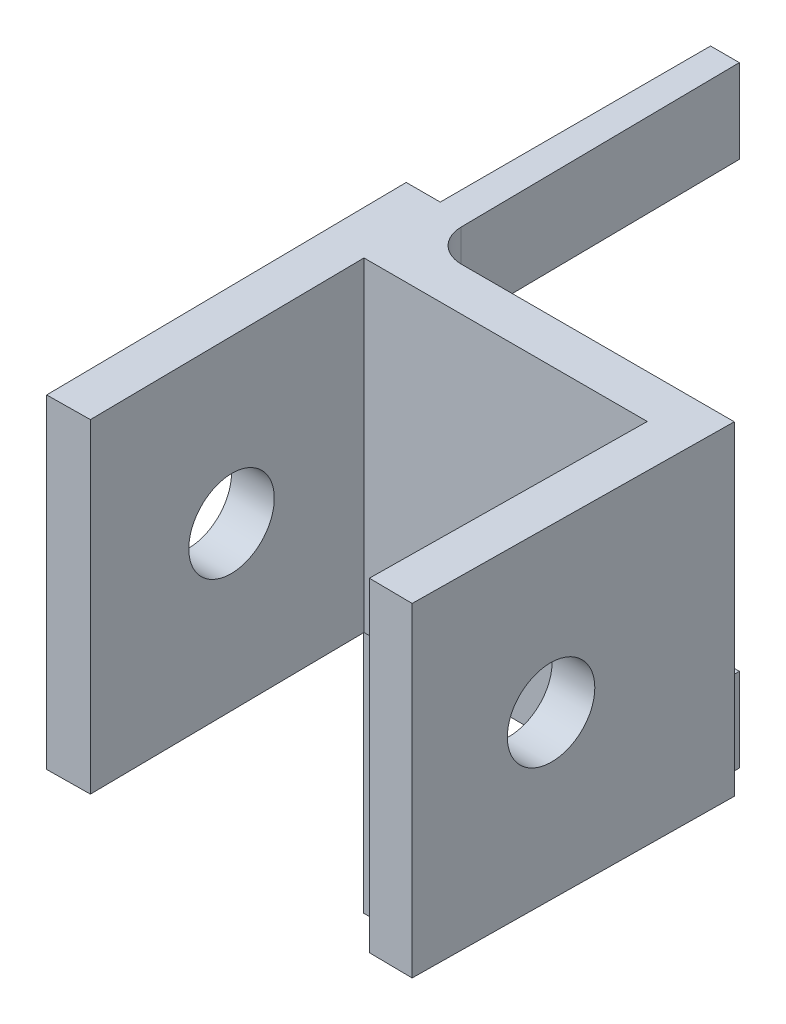
ISO-10303-21;
HEADER;
FILE_DESCRIPTION(('STEP AP214'),'2;1');
FILE_NAME('part.step','',(''),(''),'','','');
FILE_SCHEMA(('AUTOMOTIVE_DESIGN { 1 0 10303 214 1 1 1 1 }'));
ENDSEC;
DATA;
#1=APPLICATION_CONTEXT('core data for automotive mechanical design processes');
#2=APPLICATION_PROTOCOL_DEFINITION('international standard','automotive_design',2000,#1);
#3=PRODUCT_CONTEXT('',#1,'mechanical');
#4=PRODUCT('Part','Part','',(#3));
#5=PRODUCT_RELATED_PRODUCT_CATEGORY('part','',(#4));
#6=PRODUCT_DEFINITION_FORMATION('','',#4);
#7=PRODUCT_DEFINITION_CONTEXT('part definition',#1,'design');
#8=PRODUCT_DEFINITION('design','',#6,#7);
#9=PRODUCT_DEFINITION_SHAPE('','',#8);
#10=(LENGTH_UNIT() NAMED_UNIT(*) SI_UNIT(.MILLI.,.METRE.));
#11=(NAMED_UNIT(*) PLANE_ANGLE_UNIT() SI_UNIT($,.RADIAN.));
#12=(NAMED_UNIT(*) SI_UNIT($,.STERADIAN.) SOLID_ANGLE_UNIT());
#13=UNCERTAINTY_MEASURE_WITH_UNIT(LENGTH_MEASURE(1.E-05),#10,'distance_accuracy_value','');
#14=(GEOMETRIC_REPRESENTATION_CONTEXT(3) GLOBAL_UNCERTAINTY_ASSIGNED_CONTEXT((#13)) GLOBAL_UNIT_ASSIGNED_CONTEXT((#10,
#11,#12)) REPRESENTATION_CONTEXT('',''));
#15=CARTESIAN_POINT('',(0.,0.,0.));
#16=DIRECTION('',(0.,0.,1.));
#17=DIRECTION('',(1.,0.,0.));
#18=AXIS2_PLACEMENT_3D('',#15,#16,#17);
#19=CARTESIAN_POINT('',(-14.0466882817287,-26.5,-20.8));
#20=DIRECTION('',(0.,0.,-1.));
#21=DIRECTION('',(-1.,0.,0.));
#22=AXIS2_PLACEMENT_3D('',#19,#20,#21);
#23=PLANE('',#22);
#24=DIRECTION('',(1.,0.,0.));
#25=VECTOR('',#24,1.);
#26=CARTESIAN_POINT('',(-14.0466882817287,22.25,-20.8));
#27=LINE('',#26,#25);
#28=CARTESIAN_POINT('',(-17.1940246487742,22.25,-20.8));
#29=VERTEX_POINT('',#28);
#30=CARTESIAN_POINT('',(-14.0466882817287,22.25,-20.8));
#31=VERTEX_POINT('',#30);
#32=EDGE_CURVE('E423',#29,#31,#27,.T.);
#33=ORIENTED_EDGE('',*,*,#32,.F.);
#34=DIRECTION('',(0.,1.,0.));
#35=VECTOR('',#34,1.);
#36=CARTESIAN_POINT('',(-17.1940246487742,-26.5,-20.8));
#37=LINE('',#36,#35);
#38=CARTESIAN_POINT('',(-17.1940246487742,30.,-20.8));
#39=VERTEX_POINT('',#38);
#40=EDGE_CURVE('E359',#29,#39,#37,.T.);
#41=ORIENTED_EDGE('',*,*,#40,.T.);
#42=DIRECTION('',(-1.,0.,0.));
#43=VECTOR('',#42,1.);
#44=CARTESIAN_POINT('',(-14.0466882817287,30.,-20.8));
#45=LINE('',#44,#43);
#46=CARTESIAN_POINT('',(-14.0466882817287,30.,-20.8));
#47=VERTEX_POINT('',#46);
#48=EDGE_CURVE('E351',#47,#39,#45,.T.);
#49=ORIENTED_EDGE('',*,*,#48,.F.);
#50=DIRECTION('',(0.,1.,0.));
#51=VECTOR('',#50,1.);
#52=CARTESIAN_POINT('',(-14.0466882817287,-26.5,-20.8));
#53=LINE('',#52,#51);
#54=EDGE_CURVE('E362',#31,#47,#53,.T.);
#55=ORIENTED_EDGE('',*,*,#54,.F.);
#56=EDGE_LOOP('',(#33,#41,#49,#55));
#57=FACE_BOUND('',#56,.T.);
#58=ADVANCED_FACE('F35',(#57),#23,.T.);
#59=CARTESIAN_POINT('',(-14.0466882817289,-26.5,-45.8));
#60=DIRECTION('',(-1.,0.,0.));
#61=DIRECTION('',(0.,0.,1.));
#62=AXIS2_PLACEMENT_3D('',#59,#60,#61);
#63=PLANE('',#62);
#64=DIRECTION('',(0.,0.,-1.));
#65=VECTOR('',#64,1.);
#66=CARTESIAN_POINT('',(-14.0466882817289,22.25,-45.8));
#67=LINE('',#66,#65);
#68=CARTESIAN_POINT('',(-14.0466882817289,22.25,-45.7688164763179));
#69=VERTEX_POINT('',#68);
#70=EDGE_CURVE('E211',#31,#69,#67,.T.);
#71=ORIENTED_EDGE('',*,*,#70,.F.);
#72=ORIENTED_EDGE('',*,*,#54,.T.);
#73=DIRECTION('',(0.,0.,1.));
#74=VECTOR('',#73,1.);
#75=CARTESIAN_POINT('',(-14.0466882817289,30.,-45.8));
#76=LINE('',#75,#74);
#77=CARTESIAN_POINT('',(-14.0466882817289,30.,-45.8));
#78=VERTEX_POINT('',#77);
#79=EDGE_CURVE('E342',#78,#47,#76,.T.);
#80=ORIENTED_EDGE('',*,*,#79,.F.);
#81=DIRECTION('',(0.,1.,0.));
#82=VECTOR('',#81,1.);
#83=CARTESIAN_POINT('',(-14.0466882817289,-26.5,-45.8));
#84=LINE('',#83,#82);
#85=CARTESIAN_POINT('',(-14.0466882817289,22.2445675649289,-45.8));
#86=VERTEX_POINT('',#85);
#87=EDGE_CURVE('E232',#86,#78,#84,.T.);
#88=ORIENTED_EDGE('',*,*,#87,.F.);
#89=DIRECTION('',(0.,0.171623700854752,0.985162578108263));
#90=VECTOR('',#89,1.);
#91=CARTESIAN_POINT('',(-14.046688281729,20.8088112092602,-54.0415973192597));
#92=LINE('',#91,#90);
#93=EDGE_CURVE('E196',#86,#69,#92,.T.);
#94=ORIENTED_EDGE('',*,*,#93,.T.);
#95=EDGE_LOOP('',(#71,#72,#80,#88,#94));
#96=FACE_BOUND('',#95,.T.);
#97=ADVANCED_FACE('F374',(#96),#63,.T.);
#98=CARTESIAN_POINT('',(-11.3856942608503,-26.5,-45.8));
#99=DIRECTION('',(0.,0.,-1.));
#100=DIRECTION('',(-1.,0.,0.));
#101=AXIS2_PLACEMENT_3D('',#98,#99,#100);
#102=PLANE('',#101);
#103=DIRECTION('',(0.,1.,0.));
#104=VECTOR('',#103,1.);
#105=CARTESIAN_POINT('',(-11.3856942608503,-26.5,-45.8));
#106=LINE('',#105,#104);
#107=CARTESIAN_POINT('',(-11.3856942608503,22.25,-45.8000000000001));
#108=VERTEX_POINT('',#107);
#109=CARTESIAN_POINT('',(-11.3856942608503,30.,-45.8));
#110=VERTEX_POINT('',#109);
#111=EDGE_CURVE('E218',#108,#110,#106,.T.);
#112=ORIENTED_EDGE('',*,*,#111,.F.);
#113=DIRECTION('',(-0.999997916133284,-0.00204150167493103,0.));
#114=VECTOR('',#113,1.);
#115=CARTESIAN_POINT('',(-11.4852172601101,22.2497968232069,-45.8));
#116=LINE('',#115,#114);
#117=EDGE_CURVE('E191',#108,#86,#116,.T.);
#118=ORIENTED_EDGE('',*,*,#117,.T.);
#119=ORIENTED_EDGE('',*,*,#87,.T.);
#120=DIRECTION('',(-1.,0.,0.));
#121=VECTOR('',#120,1.);
#122=CARTESIAN_POINT('',(-11.3856942608503,30.,-45.8));
#123=LINE('',#122,#121);
#124=EDGE_CURVE('E227',#110,#78,#123,.T.);
#125=ORIENTED_EDGE('',*,*,#124,.F.);
#126=EDGE_LOOP('',(#112,#118,#119,#125));
#127=FACE_BOUND('',#126,.T.);
#128=ADVANCED_FACE('F225',(#127),#102,.T.);
#129=CARTESIAN_POINT('',(0.,30.,0.));
#130=DIRECTION('',(0.,1.,0.));
#131=DIRECTION('',(0.,0.,1.));
#132=AXIS2_PLACEMENT_3D('',#129,#130,#131);
#133=PLANE('',#132);
#134=DIRECTION('',(-1.,0.,0.));
#135=VECTOR('',#134,1.);
#136=CARTESIAN_POINT('',(-17.1471496487741,30.,-16.8));
#137=LINE('',#136,#135);
#138=CARTESIAN_POINT('',(17.1475230853167,30.,-16.8));
#139=VERTEX_POINT('',#138);
#140=CARTESIAN_POINT('',(-8.08080077426948,30.,-16.8));
#141=VERTEX_POINT('',#140);
#142=EDGE_CURVE('E267',#139,#141,#137,.T.);
#143=ORIENTED_EDGE('',*,*,#142,.T.);
#144=CARTESIAN_POINT('',(-8.08080077426948,30.,-19.8));
#145=DIRECTION('',(0.,1.,0.));
#146=DIRECTION('',(0.,0.,1.));
#147=AXIS2_PLACEMENT_3D('',#144,#145,#146);
#148=CIRCLE('',#147,3.);
#149=CARTESIAN_POINT('',(-11.0805948018314,30.,-19.7648461637395));
#150=VERTEX_POINT('',#149);
#151=EDGE_CURVE('E201',#141,#150,#148,.F.);
#152=ORIENTED_EDGE('',*,*,#151,.T.);
#153=DIRECTION('',(-0.0117179454201706,0.,-0.99993134252064));
#154=VECTOR('',#153,1.);
#155=CARTESIAN_POINT('',(-11.0458505108501,30.,-16.8));
#156=LINE('',#155,#154);
#157=EDGE_CURVE('E339',#150,#110,#156,.T.);
#158=ORIENTED_EDGE('',*,*,#157,.T.);
#159=ORIENTED_EDGE('',*,*,#124,.T.);
#160=ORIENTED_EDGE('',*,*,#79,.T.);
#161=ORIENTED_EDGE('',*,*,#48,.T.);
#162=DIRECTION('',(0.0117179454201639,0.,0.99993134252064));
#163=VECTOR('',#162,1.);
#164=CARTESIAN_POINT('',(-16.7997253700826,30.,12.8468717816807));
#165=LINE('',#164,#163);
#166=CARTESIAN_POINT('',(-16.7997253700826,30.,12.8468717816807));
#167=VERTEX_POINT('',#166);
#168=EDGE_CURVE('E270',#39,#167,#165,.T.);
#169=ORIENTED_EDGE('',*,*,#168,.T.);
#170=DIRECTION('',(0.999931342520641,0.,-0.0117179454201641));
#171=VECTOR('',#170,1.);
#172=CARTESIAN_POINT('',(-16.7997253700826,30.,12.8468717816807));
#173=LINE('',#172,#171);
#174=CARTESIAN_POINT('',(-12.8,30.,12.8));
#175=VERTEX_POINT('',#174);
#176=EDGE_CURVE('E252',#167,#175,#173,.T.);
#177=ORIENTED_EDGE('',*,*,#176,.T.);
#178=DIRECTION('',(-0.0117179454201639,0.,-0.99993134252064));
#179=VECTOR('',#178,1.);
#180=CARTESIAN_POINT('',(-12.8,30.,12.8));
#181=LINE('',#180,#179);
#182=CARTESIAN_POINT('',(-13.1,30.,-12.8));
#183=VERTEX_POINT('',#182);
#184=EDGE_CURVE('E255',#175,#183,#181,.T.);
#185=ORIENTED_EDGE('',*,*,#184,.T.);
#186=DIRECTION('',(1.,0.,0.));
#187=VECTOR('',#186,1.);
#188=CARTESIAN_POINT('',(-13.1,30.,-12.8));
#189=LINE('',#188,#187);
#190=CARTESIAN_POINT('',(13.1,30.,-12.8));
#191=VERTEX_POINT('',#190);
#192=EDGE_CURVE('E259',#183,#191,#189,.T.);
#193=ORIENTED_EDGE('',*,*,#192,.T.);
#194=DIRECTION('',(-0.0118101998876842,0.,0.999930257157274));
#195=VECTOR('',#194,1.);
#196=CARTESIAN_POINT('',(13.1,30.,-12.8));
#197=LINE('',#196,#195);
#198=CARTESIAN_POINT('',(12.8,30.,12.6));
#199=VERTEX_POINT('',#198);
#200=EDGE_CURVE('E261',#191,#199,#197,.T.);
#201=ORIENTED_EDGE('',*,*,#200,.T.);
#202=DIRECTION('',(0.999930257157274,0.,0.0118101998876842));
#203=VECTOR('',#202,1.);
#204=CARTESIAN_POINT('',(12.8,30.,12.6));
#205=LINE('',#204,#203);
#206=CARTESIAN_POINT('',(16.7997210286291,30.,12.6472407995507));
#207=VERTEX_POINT('',#206);
#208=EDGE_CURVE('E263',#199,#207,#205,.T.);
#209=ORIENTED_EDGE('',*,*,#208,.T.);
#210=DIRECTION('',(0.0118101998876842,0.,-0.999930257157274));
#211=VECTOR('',#210,1.);
#212=CARTESIAN_POINT('',(17.1475230853167,30.,-16.8));
#213=LINE('',#212,#211);
#214=EDGE_CURVE('E265',#207,#139,#213,.T.);
#215=ORIENTED_EDGE('',*,*,#214,.T.);
#216=EDGE_LOOP('',(#143,#152,#158,#159,#160,#161,#169,#177,#185,#193,#201,#209,#215));
#217=FACE_BOUND('',#216,.T.);
#218=ADVANCED_FACE('F375',(#217),#133,.T.);
#219=CARTESIAN_POINT('',(0.,0.,0.));
#220=DIRECTION('',(0.,1.,0.));
#221=DIRECTION('',(0.,0.,1.));
#222=AXIS2_PLACEMENT_3D('',#219,#220,#221);
#223=PLANE('',#222);
#224=DIRECTION('',(-1.,0.,0.));
#225=VECTOR('',#224,1.);
#226=CARTESIAN_POINT('',(0.,0.,-13.8));
#227=LINE('',#226,#225);
#228=CARTESIAN_POINT('',(-17.1119933987741,0.,-13.8));
#229=VERTEX_POINT('',#228);
#230=CARTESIAN_POINT('',(-8.01048827426944,0.,-13.8));
#231=VERTEX_POINT('',#230);
#232=EDGE_CURVE('E57',#229,#231,#227,.F.);
#233=ORIENTED_EDGE('',*,*,#232,.T.);
#234=DIRECTION('',(0.0117179454201706,0.,0.99993134252064));
#235=VECTOR('',#234,1.);
#236=CARTESIAN_POINT('',(-7.84769180780404,0.,0.0919651383727572));
#237=LINE('',#236,#235);
#238=CARTESIAN_POINT('',(-8.04564452426946,0.,-16.8));
#239=VERTEX_POINT('',#238);
#240=EDGE_CURVE('E324',#231,#239,#237,.F.);
#241=ORIENTED_EDGE('',*,*,#240,.T.);
#242=DIRECTION('',(-1.,0.,0.));
#243=VECTOR('',#242,1.);
#244=CARTESIAN_POINT('',(-17.1471496487741,0.,-16.8));
#245=LINE('',#244,#243);
#246=CARTESIAN_POINT('',(17.1475230853167,0.,-16.8));
#247=VERTEX_POINT('',#246);
#248=EDGE_CURVE('E286',#247,#239,#245,.T.);
#249=ORIENTED_EDGE('',*,*,#248,.F.);
#250=DIRECTION('',(0.0118101998876842,0.,-0.999930257157274));
#251=VECTOR('',#250,1.);
#252=CARTESIAN_POINT('',(17.1475230853167,0.,-16.8));
#253=LINE('',#252,#251);
#254=CARTESIAN_POINT('',(16.7997210286291,0.,12.6472407995507));
#255=VERTEX_POINT('',#254);
#256=EDGE_CURVE('E284',#255,#247,#253,.T.);
#257=ORIENTED_EDGE('',*,*,#256,.F.);
#258=DIRECTION('',(0.999930257157274,0.,0.0118101998876842));
#259=VECTOR('',#258,1.);
#260=CARTESIAN_POINT('',(12.8,0.,12.6));
#261=LINE('',#260,#259);
#262=CARTESIAN_POINT('',(12.8,0.,12.6));
#263=VERTEX_POINT('',#262);
#264=EDGE_CURVE('E282',#263,#255,#261,.T.);
#265=ORIENTED_EDGE('',*,*,#264,.F.);
#266=DIRECTION('',(-0.0118101998876842,0.,0.999930257157274));
#267=VECTOR('',#266,1.);
#268=CARTESIAN_POINT('',(13.1,0.,-12.8));
#269=LINE('',#268,#267);
#270=CARTESIAN_POINT('',(13.1,0.,-12.8));
#271=VERTEX_POINT('',#270);
#272=EDGE_CURVE('E280',#271,#263,#269,.T.);
#273=ORIENTED_EDGE('',*,*,#272,.F.);
#274=DIRECTION('',(1.,0.,0.));
#275=VECTOR('',#274,1.);
#276=CARTESIAN_POINT('',(-13.1,0.,-12.8));
#277=LINE('',#276,#275);
#278=CARTESIAN_POINT('',(-13.1,0.,-12.8));
#279=VERTEX_POINT('',#278);
#280=EDGE_CURVE('E278',#279,#271,#277,.T.);
#281=ORIENTED_EDGE('',*,*,#280,.F.);
#282=DIRECTION('',(-0.0117179454201639,0.,-0.99993134252064));
#283=VECTOR('',#282,1.);
#284=CARTESIAN_POINT('',(-12.8,0.,12.8));
#285=LINE('',#284,#283);
#286=CARTESIAN_POINT('',(-12.8,0.,12.8));
#287=VERTEX_POINT('',#286);
#288=EDGE_CURVE('E275',#287,#279,#285,.T.);
#289=ORIENTED_EDGE('',*,*,#288,.F.);
#290=DIRECTION('',(0.999931342520641,0.,-0.0117179454201641));
#291=VECTOR('',#290,1.);
#292=CARTESIAN_POINT('',(-16.7997253700826,0.,12.8468717816807));
#293=LINE('',#292,#291);
#294=CARTESIAN_POINT('',(-16.7997253700826,0.,12.8468717816807));
#295=VERTEX_POINT('',#294);
#296=EDGE_CURVE('E251',#295,#287,#293,.T.);
#297=ORIENTED_EDGE('',*,*,#296,.F.);
#298=DIRECTION('',(0.0117179454201639,0.,0.99993134252064));
#299=VECTOR('',#298,1.);
#300=CARTESIAN_POINT('',(-16.7997253700826,0.,12.8468717816807));
#301=LINE('',#300,#299);
#302=EDGE_CURVE('E256',#229,#295,#301,.T.);
#303=ORIENTED_EDGE('',*,*,#302,.F.);
#304=EDGE_LOOP('',(#233,#241,#249,#257,#265,#273,#281,#289,#297,#303));
#305=FACE_BOUND('',#304,.T.);
#306=ADVANCED_FACE('F377',(#305),#223,.F.);
#307=CARTESIAN_POINT('',(-16.7997253700826,30.,12.8468717816807));
#308=DIRECTION('',(-0.0117179454201641,0.,-0.99993134252064));
#309=DIRECTION('',(-0.99993134252064,0.,0.0117179454201641));
#310=AXIS2_PLACEMENT_3D('',#307,#308,#309);
#311=PLANE('',#310);
#312=ORIENTED_EDGE('',*,*,#296,.T.);
#313=DIRECTION('',(0.,-1.,0.));
#314=VECTOR('',#313,1.);
#315=CARTESIAN_POINT('',(-12.8,30.,12.8));
#316=LINE('',#315,#314);
#317=EDGE_CURVE('E307',#175,#287,#316,.T.);
#318=ORIENTED_EDGE('',*,*,#317,.F.);
#319=ORIENTED_EDGE('',*,*,#176,.F.);
#320=DIRECTION('',(0.,-1.,0.));
#321=VECTOR('',#320,1.);
#322=CARTESIAN_POINT('',(-16.7997253700826,30.,12.8468717816807));
#323=LINE('',#322,#321);
#324=EDGE_CURVE('E272',#167,#295,#323,.T.);
#325=ORIENTED_EDGE('',*,*,#324,.T.);
#326=EDGE_LOOP('',(#312,#318,#319,#325));
#327=FACE_BOUND('',#326,.T.);
#328=ADVANCED_FACE('F383',(#327),#311,.F.);
#329=CARTESIAN_POINT('',(-12.8,30.,12.8));
#330=DIRECTION('',(-0.99993134252064,0.,0.0117179454201639));
#331=DIRECTION('',(0.0117179454201639,0.,0.99993134252064));
#332=AXIS2_PLACEMENT_3D('',#329,#330,#331);
#333=PLANE('',#332);
#334=CARTESIAN_POINT('',(-12.9547469811038,15.,-0.4050757208542));
#335=DIRECTION('',(-0.99993134252064,0.,0.0117179454201639));
#336=DIRECTION('',(0.0117179454201639,0.,0.99993134252064));
#337=AXIS2_PLACEMENT_3D('',#334,#335,#336);
#338=ELLIPSE('',#337,4.00110745377421,4.);
#339=CARTESIAN_POINT('',(-12.9078622223402,15.,3.59575702696759));
#340=VERTEX_POINT('',#339);
#341=EDGE_CURVE('E248',#340,#340,#338,.T.);
#342=ORIENTED_EDGE('',*,*,#341,.T.);
#343=EDGE_LOOP('',(#342));
#344=FACE_BOUND('',#343,.T.);
#345=ORIENTED_EDGE('',*,*,#288,.T.);
#346=DIRECTION('',(0.,-1.,0.));
#347=VECTOR('',#346,1.);
#348=CARTESIAN_POINT('',(-13.1,30.,-12.8));
#349=LINE('',#348,#347);
#350=EDGE_CURVE('E304',#183,#279,#349,.T.);
#351=ORIENTED_EDGE('',*,*,#350,.F.);
#352=ORIENTED_EDGE('',*,*,#184,.F.);
#353=ORIENTED_EDGE('',*,*,#317,.T.);
#354=EDGE_LOOP('',(#345,#351,#352,#353));
#355=FACE_BOUND('',#354,.T.);
#356=ADVANCED_FACE('F470',(#344,#355),#333,.F.);
#357=CARTESIAN_POINT('',(-13.1,30.,-12.8));
#358=DIRECTION('',(0.,0.,-1.));
#359=DIRECTION('',(-1.,0.,0.));
#360=AXIS2_PLACEMENT_3D('',#357,#358,#359);
#361=PLANE('',#360);
#362=ORIENTED_EDGE('',*,*,#192,.F.);
#363=ORIENTED_EDGE('',*,*,#350,.T.);
#364=ORIENTED_EDGE('',*,*,#280,.T.);
#365=DIRECTION('',(0.,-1.,0.));
#366=VECTOR('',#365,1.);
#367=CARTESIAN_POINT('',(13.1,30.,-12.8));
#368=LINE('',#367,#366);
#369=EDGE_CURVE('E301',#191,#271,#368,.T.);
#370=ORIENTED_EDGE('',*,*,#369,.F.);
#371=EDGE_LOOP('',(#362,#363,#364,#370));
#372=FACE_BOUND('',#371,.T.);
#373=ADVANCED_FACE('F472',(#372),#361,.F.);
#374=CARTESIAN_POINT('',(13.1,30.,-12.8));
#375=DIRECTION('',(0.999930257157274,0.,0.0118101998876842));
#376=DIRECTION('',(0.0118101998876842,0.,-0.999930257157275));
#377=AXIS2_PLACEMENT_3D('',#374,#375,#376);
#378=PLANE('',#377);
#379=CARTESIAN_POINT('',(12.9499895385736,15.,-0.0991142658973837));
#380=DIRECTION('',(0.999930257157274,0.,0.0118101998876842));
#381=DIRECTION('',(0.0118101998876842,0.,-0.999930257157275));
#382=AXIS2_PLACEMENT_3D('',#379,#380,#381);
#383=CIRCLE('',#382,4.);
#384=CARTESIAN_POINT('',(12.9972303381243,15.,-4.09883529452648));
#385=VERTEX_POINT('',#384);
#386=EDGE_CURVE('E245',#385,#385,#383,.T.);
#387=ORIENTED_EDGE('',*,*,#386,.T.);
#388=EDGE_LOOP('',(#387));
#389=FACE_BOUND('',#388,.T.);
#390=ORIENTED_EDGE('',*,*,#272,.T.);
#391=DIRECTION('',(0.,-1.,0.));
#392=VECTOR('',#391,1.);
#393=CARTESIAN_POINT('',(12.8,30.,12.6));
#394=LINE('',#393,#392);
#395=EDGE_CURVE('E298',#199,#263,#394,.T.);
#396=ORIENTED_EDGE('',*,*,#395,.F.);
#397=ORIENTED_EDGE('',*,*,#200,.F.);
#398=ORIENTED_EDGE('',*,*,#369,.T.);
#399=EDGE_LOOP('',(#390,#396,#397,#398));
#400=FACE_BOUND('',#399,.T.);
#401=ADVANCED_FACE('F479',(#389,#400),#378,.F.);
#402=CARTESIAN_POINT('',(12.8,30.,12.6));
#403=DIRECTION('',(0.0118101998876842,0.,-0.999930257157274));
#404=DIRECTION('',(-0.999930257157275,0.,-0.0118101998876842));
#405=AXIS2_PLACEMENT_3D('',#402,#403,#404);
#406=PLANE('',#405);
#407=ORIENTED_EDGE('',*,*,#264,.T.);
#408=DIRECTION('',(0.,-1.,0.));
#409=VECTOR('',#408,1.);
#410=CARTESIAN_POINT('',(16.7997210286291,30.,12.6472407995507));
#411=LINE('',#410,#409);
#412=EDGE_CURVE('E295',#207,#255,#411,.T.);
#413=ORIENTED_EDGE('',*,*,#412,.F.);
#414=ORIENTED_EDGE('',*,*,#208,.F.);
#415=ORIENTED_EDGE('',*,*,#395,.T.);
#416=EDGE_LOOP('',(#407,#413,#414,#415));
#417=FACE_BOUND('',#416,.T.);
#418=ADVANCED_FACE('F483',(#417),#406,.F.);
#419=CARTESIAN_POINT('',(17.1475230853167,30.,-16.8));
#420=DIRECTION('',(-0.999930257157274,0.,-0.0118101998876842));
#421=DIRECTION('',(-0.0118101998876842,0.,0.999930257157275));
#422=AXIS2_PLACEMENT_3D('',#419,#420,#421);
#423=PLANE('',#422);
#424=CARTESIAN_POINT('',(16.9497105672027,15.,-0.0518734663466469));
#425=DIRECTION('',(0.999930257157274,0.,0.0118101998876842));
#426=DIRECTION('',(0.0118101998876842,0.,-0.999930257157274));
#427=AXIS2_PLACEMENT_3D('',#424,#425,#426);
#428=CIRCLE('',#427,4.);
#429=CARTESIAN_POINT('',(16.9969513667534,15.,-4.05159449497575));
#430=VERTEX_POINT('',#429);
#431=EDGE_CURVE('E240',#430,#430,#428,.T.);
#432=ORIENTED_EDGE('',*,*,#431,.F.);
#433=EDGE_LOOP('',(#432));
#434=FACE_BOUND('',#433,.T.);
#435=ORIENTED_EDGE('',*,*,#256,.T.);
#436=DIRECTION('',(0.,-1.,0.));
#437=VECTOR('',#436,1.);
#438=CARTESIAN_POINT('',(17.1475230853167,30.,-16.8));
#439=LINE('',#438,#437);
#440=EDGE_CURVE('E292',#139,#247,#439,.T.);
#441=ORIENTED_EDGE('',*,*,#440,.F.);
#442=ORIENTED_EDGE('',*,*,#214,.F.);
#443=ORIENTED_EDGE('',*,*,#412,.T.);
#444=EDGE_LOOP('',(#435,#441,#442,#443));
#445=FACE_BOUND('',#444,.T.);
#446=ADVANCED_FACE('F488',(#434,#445),#423,.F.);
#447=CARTESIAN_POINT('',(-17.1471496487741,30.,-16.8));
#448=DIRECTION('',(0.,0.,1.));
#449=DIRECTION('',(1.,0.,0.));
#450=AXIS2_PLACEMENT_3D('',#447,#448,#449);
#451=PLANE('',#450);
#452=ORIENTED_EDGE('',*,*,#248,.T.);
#453=CARTESIAN_POINT('',(-8.04564452426946,-3.,-16.8));
#454=DIRECTION('',(0.,0.,1.));
#455=DIRECTION('',(1.,0.,0.));
#456=AXIS2_PLACEMENT_3D('',#453,#454,#455);
#457=ELLIPSE('',#456,3.0002059865806,3.);
#458=CARTESIAN_POINT('',(-8.08080077426948,-0.000205972438077628,-16.8));
#459=VERTEX_POINT('',#458);
#460=EDGE_CURVE('E43',#239,#459,#457,.T.);
#461=ORIENTED_EDGE('',*,*,#460,.T.);
#462=DIRECTION('',(0.,1.,0.));
#463=VECTOR('',#462,1.);
#464=CARTESIAN_POINT('',(-8.08080077426948,30.,-16.8));
#465=LINE('',#464,#463);
#466=EDGE_CURVE('E49',#459,#141,#465,.T.);
#467=ORIENTED_EDGE('',*,*,#466,.T.);
#468=ORIENTED_EDGE('',*,*,#142,.F.);
#469=ORIENTED_EDGE('',*,*,#440,.T.);
#470=EDGE_LOOP('',(#452,#461,#467,#468,#469));
#471=FACE_BOUND('',#470,.T.);
#472=ADVANCED_FACE('F330',(#471),#451,.F.);
#473=CARTESIAN_POINT('',(-16.7997253700826,30.,12.8468717816807));
#474=DIRECTION('',(0.99993134252064,0.,-0.0117179454201639));
#475=DIRECTION('',(-0.0117179454201639,0.,-0.99993134252064));
#476=AXIS2_PLACEMENT_3D('',#473,#474,#475);
#477=PLANE('',#476);
#478=ORIENTED_EDGE('',*,*,#40,.F.);
#479=DIRECTION('',(0.0117179454201639,0.,0.99993134252064));
#480=VECTOR('',#479,1.);
#481=CARTESIAN_POINT('',(-16.7997253700826,22.25,12.8468717816807));
#482=LINE('',#481,#480);
#483=CARTESIAN_POINT('',(-17.1932069923914,22.25,-20.7302266553389));
#484=VERTEX_POINT('',#483);
#485=EDGE_CURVE('E425',#29,#484,#482,.T.);
#486=ORIENTED_EDGE('',*,*,#485,.T.);
#487=DIRECTION('',(0.,-1.,0.));
#488=VECTOR('',#487,1.);
#489=CARTESIAN_POINT('',(-17.1932069923914,30.,-20.7302266553389));
#490=LINE('',#489,#488);
#491=CARTESIAN_POINT('',(-17.1932069923914,-18.75,-20.7302266553389));
#492=VERTEX_POINT('',#491);
#493=EDGE_CURVE('E344',#484,#492,#490,.T.);
#494=ORIENTED_EDGE('',*,*,#493,.T.);
#495=DIRECTION('',(-0.0117179454201639,0.,-0.99993134252064));
#496=VECTOR('',#495,1.);
#497=CARTESIAN_POINT('',(-16.7997253700826,-18.75,12.8468717816807));
#498=LINE('',#497,#496);
#499=CARTESIAN_POINT('',(-17.1940246487742,-18.75,-20.8));
#500=VERTEX_POINT('',#499);
#501=EDGE_CURVE('E414',#492,#500,#498,.T.);
#502=ORIENTED_EDGE('',*,*,#501,.T.);
#503=CARTESIAN_POINT('',(-17.1940246487742,-26.5,-20.8));
#504=VERTEX_POINT('',#503);
#505=EDGE_CURVE('E357',#504,#500,#37,.T.);
#506=ORIENTED_EDGE('',*,*,#505,.F.);
#507=DIRECTION('',(0.0117179454201729,0.,0.99993134252064));
#508=VECTOR('',#507,1.);
#509=CARTESIAN_POINT('',(-17.1940246487742,-26.5,-20.8));
#510=LINE('',#509,#508);
#511=CARTESIAN_POINT('',(-17.1471496487741,-26.5,-16.8));
#512=VERTEX_POINT('',#511);
#513=EDGE_CURVE('E234',#504,#512,#510,.T.);
#514=ORIENTED_EDGE('',*,*,#513,.T.);
#515=DIRECTION('',(0.,1.,0.));
#516=VECTOR('',#515,1.);
#517=CARTESIAN_POINT('',(-17.1471496487741,-26.5,-16.8));
#518=LINE('',#517,#516);
#519=CARTESIAN_POINT('',(-17.1471496487741,-3.,-16.8));
#520=VERTEX_POINT('',#519);
#521=EDGE_CURVE('E244',#512,#520,#518,.T.);
#522=ORIENTED_EDGE('',*,*,#521,.T.);
#523=CARTESIAN_POINT('',(-17.1119933987741,-3.,-13.8));
#524=DIRECTION('',(0.99993134252064,0.,-0.0117179454201639));
#525=DIRECTION('',(-0.0117179454201639,0.,-0.99993134252064));
#526=AXIS2_PLACEMENT_3D('',#523,#524,#525);
#527=ELLIPSE('',#526,3.0002059865806,3.);
#528=EDGE_CURVE('E319',#520,#229,#527,.T.);
#529=ORIENTED_EDGE('',*,*,#528,.T.);
#530=ORIENTED_EDGE('',*,*,#302,.T.);
#531=ORIENTED_EDGE('',*,*,#324,.F.);
#532=ORIENTED_EDGE('',*,*,#168,.F.);
#533=EDGE_LOOP('',(#478,#486,#494,#502,#506,#514,#522,#529,#530,#531,#532));
#534=FACE_BOUND('',#533,.T.);
#535=CARTESIAN_POINT('',(-16.9555753862701,15.,-0.452329599655377));
#536=DIRECTION('',(0.99993134252064,0.,-0.0117179454201639));
#537=DIRECTION('',(0.0117179454201639,0.,0.99993134252064));
#538=AXIS2_PLACEMENT_3D('',#535,#536,#537);
#539=ELLIPSE('',#538,4.00110745377421,4.);
#540=CARTESIAN_POINT('',(-16.9086906275066,15.,3.54850314816641));
#541=VERTEX_POINT('',#540);
#542=EDGE_CURVE('E243',#541,#541,#539,.T.);
#543=ORIENTED_EDGE('',*,*,#542,.T.);
#544=EDGE_LOOP('',(#543));
#545=FACE_BOUND('',#544,.T.);
#546=ADVANCED_FACE('F442',(#534,#545),#477,.F.);
#547=CARTESIAN_POINT('',(-23.0474997190883,15.,-0.524281461854016));
#548=DIRECTION('',(0.999930257157274,0.,0.0118101998876842));
#549=DIRECTION('',(0.0118101998876842,0.,-0.999930257157275));
#550=AXIS2_PLACEMENT_3D('',#547,#548,#549);
#551=CYLINDRICAL_SURFACE('',#550,4.);
#552=ORIENTED_EDGE('',*,*,#542,.F.);
#553=EDGE_LOOP('',(#552));
#554=FACE_BOUND('',#553,.T.);
#555=ORIENTED_EDGE('',*,*,#341,.F.);
#556=EDGE_LOOP('',(#555));
#557=FACE_BOUND('',#556,.T.);
#558=ADVANCED_FACE('F406',(#554,#557),#551,.F.);
#559=ORIENTED_EDGE('',*,*,#431,.T.);
#560=EDGE_LOOP('',(#559));
#561=FACE_BOUND('',#560,.T.);
#562=ORIENTED_EDGE('',*,*,#386,.F.);
#563=EDGE_LOOP('',(#562));
#564=FACE_BOUND('',#563,.T.);
#565=ADVANCED_FACE('F400',(#561,#564),#551,.F.);
#566=DIRECTION('',(-1.,0.,0.));
#567=VECTOR('',#566,1.);
#568=CARTESIAN_POINT('',(-14.0466882817287,-18.75,-20.8));
#569=LINE('',#568,#567);
#570=CARTESIAN_POINT('',(-14.0466882817287,-18.75,-20.8));
#571=VERTEX_POINT('',#570);
#572=EDGE_CURVE('E409',#571,#500,#569,.T.);
#573=ORIENTED_EDGE('',*,*,#572,.F.);
#574=CARTESIAN_POINT('',(-14.0466882817287,-26.5,-20.8));
#575=VERTEX_POINT('',#574);
#576=EDGE_CURVE('E360',#575,#571,#53,.T.);
#577=ORIENTED_EDGE('',*,*,#576,.F.);
#578=DIRECTION('',(-1.,0.,0.));
#579=VECTOR('',#578,1.);
#580=CARTESIAN_POINT('',(-14.0466882817287,-26.5,-20.8));
#581=LINE('',#580,#579);
#582=EDGE_CURVE('E437',#575,#504,#581,.T.);
#583=ORIENTED_EDGE('',*,*,#582,.T.);
#584=ORIENTED_EDGE('',*,*,#505,.T.);
#585=EDGE_LOOP('',(#573,#577,#583,#584));
#586=FACE_BOUND('',#585,.T.);
#587=ADVANCED_FACE('F391',(#586),#23,.T.);
#588=DIRECTION('',(0.,0.,1.));
#589=VECTOR('',#588,1.);
#590=CARTESIAN_POINT('',(-14.0466882817289,-18.75,-45.8));
#591=LINE('',#590,#589);
#592=CARTESIAN_POINT('',(-14.0466882817289,-18.75,-45.8));
#593=VERTEX_POINT('',#592);
#594=EDGE_CURVE('E415',#593,#571,#591,.T.);
#595=ORIENTED_EDGE('',*,*,#594,.F.);
#596=CARTESIAN_POINT('',(-14.0466882817289,-26.5,-45.8));
#597=VERTEX_POINT('',#596);
#598=EDGE_CURVE('E237',#597,#593,#84,.T.);
#599=ORIENTED_EDGE('',*,*,#598,.F.);
#600=DIRECTION('',(0.,0.,1.));
#601=VECTOR('',#600,1.);
#602=CARTESIAN_POINT('',(-14.0466882817289,-26.5,-45.8));
#603=LINE('',#602,#601);
#604=EDGE_CURVE('E436',#597,#575,#603,.T.);
#605=ORIENTED_EDGE('',*,*,#604,.T.);
#606=ORIENTED_EDGE('',*,*,#576,.T.);
#607=EDGE_LOOP('',(#595,#599,#605,#606));
#608=FACE_BOUND('',#607,.T.);
#609=ADVANCED_FACE('F396',(#608),#63,.T.);
#610=DIRECTION('',(-1.,0.,0.));
#611=VECTOR('',#610,1.);
#612=CARTESIAN_POINT('',(-11.3856942608503,-18.75,-45.8));
#613=LINE('',#612,#611);
#614=CARTESIAN_POINT('',(-11.3856942608503,-18.75,-45.8));
#615=VERTEX_POINT('',#614);
#616=EDGE_CURVE('E418',#615,#593,#613,.T.);
#617=ORIENTED_EDGE('',*,*,#616,.F.);
#618=CARTESIAN_POINT('',(-11.3856942608503,-26.5,-45.8));
#619=VERTEX_POINT('',#618);
#620=EDGE_CURVE('E228',#619,#615,#106,.T.);
#621=ORIENTED_EDGE('',*,*,#620,.F.);
#622=DIRECTION('',(-1.,0.,0.));
#623=VECTOR('',#622,1.);
#624=CARTESIAN_POINT('',(-11.3856942608503,-26.5,-45.8));
#625=LINE('',#624,#623);
#626=EDGE_CURVE('E434',#619,#597,#625,.T.);
#627=ORIENTED_EDGE('',*,*,#626,.T.);
#628=ORIENTED_EDGE('',*,*,#598,.T.);
#629=EDGE_LOOP('',(#617,#621,#627,#628));
#630=FACE_BOUND('',#629,.T.);
#631=ADVANCED_FACE('F386',(#630),#102,.T.);
#632=CARTESIAN_POINT('',(-11.0458505108501,-26.5,-16.8));
#633=DIRECTION('',(0.99993134252064,0.,-0.0117179454201706));
#634=DIRECTION('',(-0.0117179454201706,0.,-0.99993134252064));
#635=AXIS2_PLACEMENT_3D('',#632,#633,#634);
#636=PLANE('',#635);
#637=DIRECTION('',(0.,1.,0.));
#638=VECTOR('',#637,1.);
#639=CARTESIAN_POINT('',(-11.0805948018314,-26.5,-19.7648461637395));
#640=LINE('',#639,#638);
#641=CARTESIAN_POINT('',(-11.0805948018314,-3.,-19.7648461637395));
#642=VERTEX_POINT('',#641);
#643=EDGE_CURVE('E313',#150,#642,#640,.F.);
#644=ORIENTED_EDGE('',*,*,#643,.T.);
#645=DIRECTION('',(0.0117179454201706,0.,0.99993134252064));
#646=VECTOR('',#645,1.);
#647=CARTESIAN_POINT('',(-11.0458505108501,-3.,-16.8));
#648=LINE('',#647,#646);
#649=CARTESIAN_POINT('',(-11.0458505108501,-3.,-16.8));
#650=VERTEX_POINT('',#649);
#651=EDGE_CURVE('E321',#642,#650,#648,.T.);
#652=ORIENTED_EDGE('',*,*,#651,.T.);
#653=DIRECTION('',(0.,1.,0.));
#654=VECTOR('',#653,1.);
#655=CARTESIAN_POINT('',(-11.0458505108501,-26.5,-16.8));
#656=LINE('',#655,#654);
#657=CARTESIAN_POINT('',(-11.0458505108501,-26.5,-16.8));
#658=VERTEX_POINT('',#657);
#659=EDGE_CURVE('E229',#658,#650,#656,.T.);
#660=ORIENTED_EDGE('',*,*,#659,.F.);
#661=DIRECTION('',(-0.0117179454201706,0.,-0.99993134252064));
#662=VECTOR('',#661,1.);
#663=CARTESIAN_POINT('',(-11.0458505108501,-26.5,-16.8));
#664=LINE('',#663,#662);
#665=EDGE_CURVE('E431',#658,#619,#664,.T.);
#666=ORIENTED_EDGE('',*,*,#665,.T.);
#667=ORIENTED_EDGE('',*,*,#620,.T.);
#668=DIRECTION('',(-0.0117179454201706,0.,-0.99993134252064));
#669=VECTOR('',#668,1.);
#670=CARTESIAN_POINT('',(-10.847485835366,-18.75,0.127118974633269));
#671=LINE('',#670,#669);
#672=CARTESIAN_POINT('',(-11.092745625346,-18.75,-20.8017164369851));
#673=VERTEX_POINT('',#672);
#674=EDGE_CURVE('E222',#673,#615,#671,.T.);
#675=ORIENTED_EDGE('',*,*,#674,.F.);
#676=DIRECTION('',(0.,-1.,0.));
#677=VECTOR('',#676,1.);
#678=CARTESIAN_POINT('',(-11.092745625346,0.,-20.801716436984));
#679=LINE('',#678,#677);
#680=CARTESIAN_POINT('',(-11.092745625346,22.25,-20.801716436984));
#681=VERTEX_POINT('',#680);
#682=EDGE_CURVE('E221',#681,#673,#679,.T.);
#683=ORIENTED_EDGE('',*,*,#682,.F.);
#684=DIRECTION('',(0.0117179454201706,0.,0.99993134252064));
#685=VECTOR('',#684,1.);
#686=CARTESIAN_POINT('',(-10.847485835366,22.25,0.127118974633272));
#687=LINE('',#686,#685);
#688=EDGE_CURVE('E208',#108,#681,#687,.T.);
#689=ORIENTED_EDGE('',*,*,#688,.F.);
#690=ORIENTED_EDGE('',*,*,#111,.T.);
#691=ORIENTED_EDGE('',*,*,#157,.F.);
#692=EDGE_LOOP('',(#644,#652,#660,#666,#667,#675,#683,#689,#690,#691));
#693=FACE_BOUND('',#692,.T.);
#694=ADVANCED_FACE('F216',(#693),#636,.T.);
#695=CARTESIAN_POINT('',(-11.0466882817287,-26.5,-16.8));
#696=DIRECTION('',(0.,0.,1.));
#697=DIRECTION('',(1.,0.,0.));
#698=AXIS2_PLACEMENT_3D('',#695,#696,#697);
#699=PLANE('',#698);
#700=ORIENTED_EDGE('',*,*,#659,.T.);
#701=DIRECTION('',(-1.,0.,0.));
#702=VECTOR('',#701,1.);
#703=CARTESIAN_POINT('',(-11.0466882817287,-3.,-16.8));
#704=LINE('',#703,#702);
#705=EDGE_CURVE('E200',#650,#520,#704,.T.);
#706=ORIENTED_EDGE('',*,*,#705,.T.);
#707=ORIENTED_EDGE('',*,*,#521,.F.);
#708=DIRECTION('',(1.,0.,0.));
#709=VECTOR('',#708,1.);
#710=CARTESIAN_POINT('',(-11.0466882817287,-26.5,-16.8));
#711=LINE('',#710,#709);
#712=EDGE_CURVE('E354',#512,#658,#711,.T.);
#713=ORIENTED_EDGE('',*,*,#712,.T.);
#714=EDGE_LOOP('',(#700,#706,#707,#713));
#715=FACE_BOUND('',#714,.T.);
#716=ADVANCED_FACE('F451',(#715),#699,.T.);
#717=CARTESIAN_POINT('',(0.,-26.5,0.));
#718=DIRECTION('',(0.,1.,0.));
#719=DIRECTION('',(0.,0.,1.));
#720=AXIS2_PLACEMENT_3D('',#717,#718,#719);
#721=PLANE('',#720);
#722=ORIENTED_EDGE('',*,*,#712,.F.);
#723=ORIENTED_EDGE('',*,*,#513,.F.);
#724=ORIENTED_EDGE('',*,*,#582,.F.);
#725=ORIENTED_EDGE('',*,*,#604,.F.);
#726=ORIENTED_EDGE('',*,*,#626,.F.);
#727=ORIENTED_EDGE('',*,*,#665,.F.);
#728=EDGE_LOOP('',(#722,#723,#724,#725,#726,#727));
#729=FACE_BOUND('',#728,.T.);
#730=ADVANCED_FACE('F446',(#729),#721,.F.);
#731=CARTESIAN_POINT('',(-8.08080077426948,30.,-19.8));
#732=DIRECTION('',(0.,1.,0.));
#733=DIRECTION('',(0.,0.,1.));
#734=AXIS2_PLACEMENT_3D('',#731,#732,#733);
#735=CYLINDRICAL_SURFACE('',#734,3.);
#736=ORIENTED_EDGE('',*,*,#466,.F.);
#737=CARTESIAN_POINT('',(-8.08080077426948,-3.,-19.8));
#738=DIRECTION('',(-0.00828583866817647,0.707106781186547,-0.707058233017313));
#739=DIRECTION('',(0.00828583866817647,0.707106781186547,0.707058233017313));
#740=AXIS2_PLACEMENT_3D('',#737,#738,#739);
#741=ELLIPSE('',#740,4.24264068711928,3.);
#742=EDGE_CURVE('E11',#459,#642,#741,.F.);
#743=ORIENTED_EDGE('',*,*,#742,.T.);
#744=ORIENTED_EDGE('',*,*,#643,.F.);
#745=ORIENTED_EDGE('',*,*,#151,.F.);
#746=EDGE_LOOP('',(#736,#743,#744,#745));
#747=FACE_BOUND('',#746,.T.);
#748=ADVANCED_FACE('F337',(#747),#735,.F.);
#749=CARTESIAN_POINT('',(-67.5888664777622,0.,-20.1396525207444));
#750=DIRECTION('',(0.0117179454201706,0.,0.99993134252064));
#751=DIRECTION('',(0.99993134252064,0.,-0.0117179454201706));
#752=AXIS2_PLACEMENT_3D('',#749,#750,#751);
#753=PLANE('',#752);
#754=DIRECTION('',(0.99993134252064,0.,-0.0117179454201706));
#755=VECTOR('',#754,1.);
#756=CARTESIAN_POINT('',(-67.5888664777622,22.25,-20.1396525207444));
#757=LINE('',#756,#755);
#758=EDGE_CURVE('E212',#484,#681,#757,.T.);
#759=ORIENTED_EDGE('',*,*,#758,.T.);
#760=ORIENTED_EDGE('',*,*,#682,.T.);
#761=DIRECTION('',(0.99993134252064,0.,-0.0117179454201706));
#762=VECTOR('',#761,1.);
#763=CARTESIAN_POINT('',(-67.5888664777622,-18.75,-20.1396525207444));
#764=LINE('',#763,#762);
#765=EDGE_CURVE('E213',#492,#673,#764,.T.);
#766=ORIENTED_EDGE('',*,*,#765,.F.);
#767=ORIENTED_EDGE('',*,*,#493,.F.);
#768=EDGE_LOOP('',(#759,#760,#766,#767));
#769=FACE_BOUND('',#768,.T.);
#770=ADVANCED_FACE('F461',(#769),#753,.F.);
#771=CARTESIAN_POINT('',(-67.3436066877822,22.25,0.789182890872911));
#772=DIRECTION('',(0.,1.,0.));
#773=DIRECTION('',(0.,0.,1.));
#774=AXIS2_PLACEMENT_3D('',#771,#772,#773);
#775=PLANE('',#774);
#776=ORIENTED_EDGE('',*,*,#32,.T.);
#777=ORIENTED_EDGE('',*,*,#70,.T.);
#778=DIRECTION('',(0.99993134252064,0.,-0.0117179454201706));
#779=VECTOR('',#778,1.);
#780=CARTESIAN_POINT('',(-67.8818151132665,22.25,-45.1379360837604));
#781=LINE('',#780,#779);
#782=EDGE_CURVE('E194',#69,#108,#781,.T.);
#783=ORIENTED_EDGE('',*,*,#782,.T.);
#784=ORIENTED_EDGE('',*,*,#688,.T.);
#785=ORIENTED_EDGE('',*,*,#758,.F.);
#786=ORIENTED_EDGE('',*,*,#485,.F.);
#787=EDGE_LOOP('',(#776,#777,#783,#784,#785,#786));
#788=FACE_BOUND('',#787,.T.);
#789=ADVANCED_FACE('F206',(#788),#775,.F.);
#790=CARTESIAN_POINT('',(-67.3436066877822,-18.75,0.789182890872908));
#791=DIRECTION('',(0.,-1.,0.));
#792=DIRECTION('',(0.,0.,-1.));
#793=AXIS2_PLACEMENT_3D('',#790,#791,#792);
#794=PLANE('',#793);
#795=ORIENTED_EDGE('',*,*,#765,.T.);
#796=ORIENTED_EDGE('',*,*,#674,.T.);
#797=ORIENTED_EDGE('',*,*,#616,.T.);
#798=ORIENTED_EDGE('',*,*,#594,.T.);
#799=ORIENTED_EDGE('',*,*,#572,.T.);
#800=ORIENTED_EDGE('',*,*,#501,.F.);
#801=EDGE_LOOP('',(#795,#796,#797,#798,#799,#800));
#802=FACE_BOUND('',#801,.T.);
#803=ADVANCED_FACE('F454',(#802),#794,.F.);
#804=CARTESIAN_POINT('',(-67.4035469586208,29.3608115374809,-4.32572022069007));
#805=DIRECTION('',(0.00201121117673562,-0.985160585629515,0.171623353748006));
#806=DIRECTION('',(0.,-0.171623700854752,-0.985162578108263));
#807=AXIS2_PLACEMENT_3D('',#804,#805,#806);
#808=PLANE('',#807);
#809=ORIENTED_EDGE('',*,*,#117,.F.);
#810=ORIENTED_EDGE('',*,*,#782,.F.);
#811=ORIENTED_EDGE('',*,*,#93,.F.);
#812=EDGE_LOOP('',(#809,#810,#811));
#813=FACE_BOUND('',#812,.T.);
#814=ADVANCED_FACE('F193',(#813),#808,.T.);
#815=CARTESIAN_POINT('',(-11.0466882817287,-3.,-13.8));
#816=DIRECTION('',(-1.,0.,0.));
#817=DIRECTION('',(0.,0.,1.));
#818=AXIS2_PLACEMENT_3D('',#815,#816,#817);
#819=CYLINDRICAL_SURFACE('',#818,3.);
#820=ORIENTED_EDGE('',*,*,#705,.F.);
#821=CARTESIAN_POINT('',(-8.01048827426944,-3.,-13.8));
#822=DIRECTION('',(-0.702951653593556,0.,0.711237634486594));
#823=DIRECTION('',(-0.711237634486593,0.,-0.702951653593556));
#824=AXIS2_PLACEMENT_3D('',#821,#822,#823);
#825=ELLIPSE('',#824,4.2677188177362,3.);
#826=EDGE_CURVE('E326',#650,#231,#825,.F.);
#827=ORIENTED_EDGE('',*,*,#826,.T.);
#828=ORIENTED_EDGE('',*,*,#232,.F.);
#829=ORIENTED_EDGE('',*,*,#528,.F.);
#830=EDGE_LOOP('',(#820,#827,#828,#829));
#831=FACE_BOUND('',#830,.T.);
#832=ADVANCED_FACE('F490',(#831),#819,.F.);
#833=CARTESIAN_POINT('',(-8.04605648328814,-3.,-16.8351538362605));
#834=DIRECTION('',(0.0117179454201706,0.,0.99993134252064));
#835=DIRECTION('',(0.99993134252064,0.,-0.0117179454201706));
#836=AXIS2_PLACEMENT_3D('',#833,#834,#835);
#837=CYLINDRICAL_SURFACE('',#836,3.);
#838=ORIENTED_EDGE('',*,*,#460,.F.);
#839=ORIENTED_EDGE('',*,*,#240,.F.);
#840=ORIENTED_EDGE('',*,*,#826,.F.);
#841=ORIENTED_EDGE('',*,*,#651,.F.);
#842=ORIENTED_EDGE('',*,*,#742,.F.);
#843=EDGE_LOOP('',(#838,#839,#840,#841,#842));
#844=FACE_BOUND('',#843,.T.);
#845=ADVANCED_FACE('F37',(#844),#837,.F.);
#846=CLOSED_SHELL('',(#58,#97,#128,#218,#306,#328,#356,#373,#401,#418,#446,#472,#546,#558,#565,
#587,#609,#631,#694,#716,#730,#748,#770,#789,#803,#814,#832,#845));
#847=MANIFOLD_SOLID_BREP('B2',#846);
#848=ADVANCED_BREP_SHAPE_REPRESENTATION('',(#18,#847),#14);
#849=SHAPE_DEFINITION_REPRESENTATION(#9,#848);
ENDSEC;
END-ISO-10303-21;
